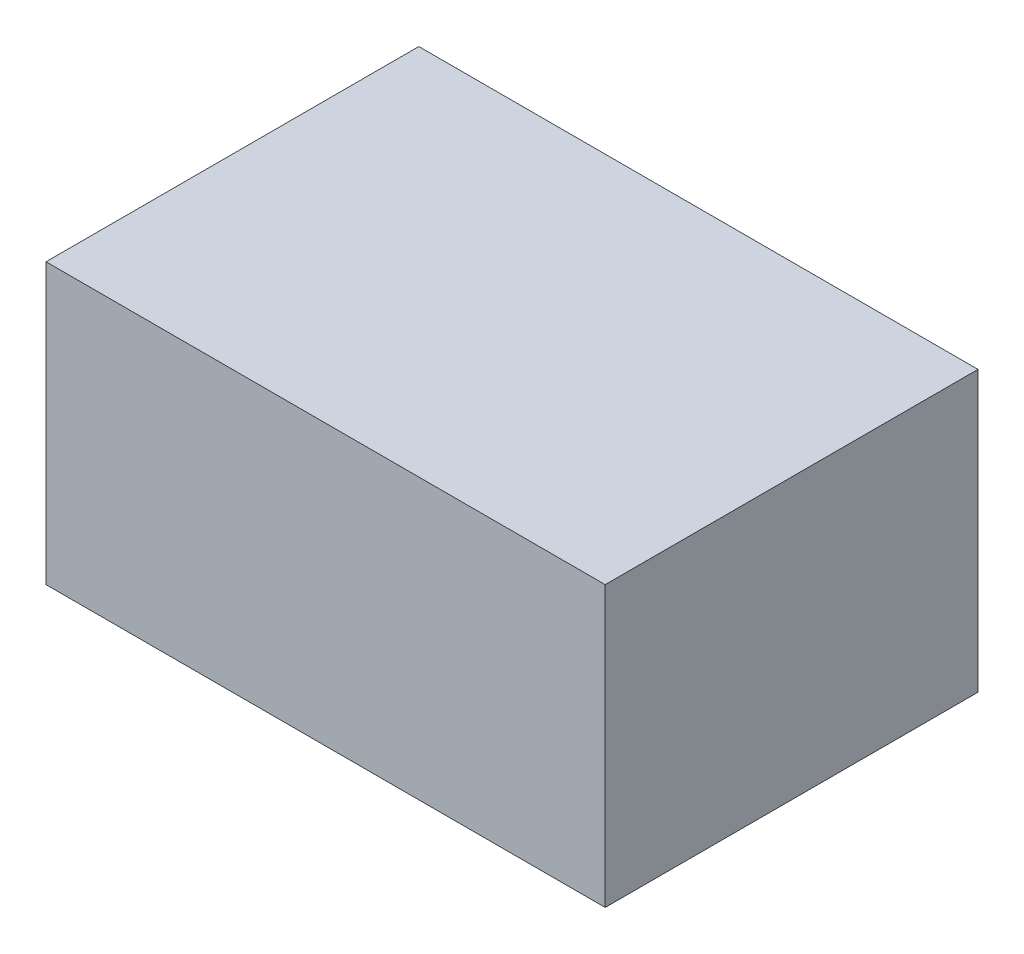
ISO-10303-21;
HEADER;
FILE_DESCRIPTION(('STEP AP214'),'2;1');
FILE_NAME('part.step','',(''),(''),'','','');
FILE_SCHEMA(('AUTOMOTIVE_DESIGN { 1 0 10303 214 1 1 1 1 }'));
ENDSEC;
DATA;
#1=APPLICATION_CONTEXT('core data for automotive mechanical design processes');
#2=APPLICATION_PROTOCOL_DEFINITION('international standard','automotive_design',2000,#1);
#3=PRODUCT_CONTEXT('',#1,'mechanical');
#4=PRODUCT('Part','Part','',(#3));
#5=PRODUCT_RELATED_PRODUCT_CATEGORY('part','',(#4));
#6=PRODUCT_DEFINITION_FORMATION('','',#4);
#7=PRODUCT_DEFINITION_CONTEXT('part definition',#1,'design');
#8=PRODUCT_DEFINITION('design','',#6,#7);
#9=PRODUCT_DEFINITION_SHAPE('','',#8);
#10=(LENGTH_UNIT() NAMED_UNIT(*) SI_UNIT(.MILLI.,.METRE.));
#11=(NAMED_UNIT(*) PLANE_ANGLE_UNIT() SI_UNIT($,.RADIAN.));
#12=(NAMED_UNIT(*) SI_UNIT($,.STERADIAN.) SOLID_ANGLE_UNIT());
#13=UNCERTAINTY_MEASURE_WITH_UNIT(LENGTH_MEASURE(1.E-05),#10,'distance_accuracy_value','');
#14=(GEOMETRIC_REPRESENTATION_CONTEXT(3) GLOBAL_UNCERTAINTY_ASSIGNED_CONTEXT((#13)) GLOBAL_UNIT_ASSIGNED_CONTEXT((#10,
#11,#12)) REPRESENTATION_CONTEXT('',''));
#15=CARTESIAN_POINT('',(0.,0.,0.));
#16=DIRECTION('',(0.,0.,1.));
#17=DIRECTION('',(1.,0.,0.));
#18=AXIS2_PLACEMENT_3D('',#15,#16,#17);
#19=CARTESIAN_POINT('',(-118.985832875961,150.,-62.890625));
#20=DIRECTION('',(1.,0.,0.));
#21=DIRECTION('',(0.,0.,-1.));
#22=AXIS2_PLACEMENT_3D('',#19,#20,#21);
#23=PLANE('',#22);
#24=DIRECTION('',(0.,0.,1.));
#25=VECTOR('',#24,1.);
#26=CARTESIAN_POINT('',(-118.985832875961,0.,-62.890625));
#27=LINE('',#26,#25);
#28=CARTESIAN_POINT('',(-118.985832875961,0.,-62.890625));
#29=VERTEX_POINT('',#28);
#30=CARTESIAN_POINT('',(-118.985832875961,0.,137.109375));
#31=VERTEX_POINT('',#30);
#32=EDGE_CURVE('E111',#29,#31,#27,.T.);
#33=ORIENTED_EDGE('',*,*,#32,.T.);
#34=DIRECTION('',(0.,-1.,0.));
#35=VECTOR('',#34,1.);
#36=CARTESIAN_POINT('',(-118.985832875961,150.,137.109375));
#37=LINE('',#36,#35);
#38=CARTESIAN_POINT('',(-118.985832875961,150.,137.109375));
#39=VERTEX_POINT('',#38);
#40=EDGE_CURVE('E11',#39,#31,#37,.T.);
#41=ORIENTED_EDGE('',*,*,#40,.F.);
#42=DIRECTION('',(0.,0.,1.));
#43=VECTOR('',#42,1.);
#44=CARTESIAN_POINT('',(-118.985832875961,150.,-62.890625));
#45=LINE('',#44,#43);
#46=CARTESIAN_POINT('',(-118.985832875961,150.,-62.890625));
#47=VERTEX_POINT('',#46);
#48=EDGE_CURVE('E95',#47,#39,#45,.T.);
#49=ORIENTED_EDGE('',*,*,#48,.F.);
#50=DIRECTION('',(0.,-1.,0.));
#51=VECTOR('',#50,1.);
#52=CARTESIAN_POINT('',(-118.985832875961,150.,-62.890625));
#53=LINE('',#52,#51);
#54=EDGE_CURVE('E107',#47,#29,#53,.T.);
#55=ORIENTED_EDGE('',*,*,#54,.T.);
#56=EDGE_LOOP('',(#33,#41,#49,#55));
#57=FACE_BOUND('',#56,.T.);
#58=ADVANCED_FACE('F43',(#57),#23,.F.);
#59=CARTESIAN_POINT('',(-118.985832875961,150.,137.109375));
#60=DIRECTION('',(0.,0.,-1.));
#61=DIRECTION('',(-1.,0.,0.));
#62=AXIS2_PLACEMENT_3D('',#59,#60,#61);
#63=PLANE('',#62);
#64=DIRECTION('',(1.,0.,0.));
#65=VECTOR('',#64,1.);
#66=CARTESIAN_POINT('',(-118.985832875961,0.,137.109375));
#67=LINE('',#66,#65);
#68=CARTESIAN_POINT('',(181.014167124039,0.,137.109375));
#69=VERTEX_POINT('',#68);
#70=EDGE_CURVE('E100',#31,#69,#67,.T.);
#71=ORIENTED_EDGE('',*,*,#70,.T.);
#72=DIRECTION('',(0.,-1.,0.));
#73=VECTOR('',#72,1.);
#74=CARTESIAN_POINT('',(181.014167124039,150.,137.109375));
#75=LINE('',#74,#73);
#76=CARTESIAN_POINT('',(181.014167124039,150.,137.109375));
#77=VERTEX_POINT('',#76);
#78=EDGE_CURVE('E52',#77,#69,#75,.T.);
#79=ORIENTED_EDGE('',*,*,#78,.F.);
#80=DIRECTION('',(1.,0.,0.));
#81=VECTOR('',#80,1.);
#82=CARTESIAN_POINT('',(-118.985832875961,150.,137.109375));
#83=LINE('',#82,#81);
#84=EDGE_CURVE('E90',#39,#77,#83,.T.);
#85=ORIENTED_EDGE('',*,*,#84,.F.);
#86=ORIENTED_EDGE('',*,*,#40,.T.);
#87=EDGE_LOOP('',(#71,#79,#85,#86));
#88=FACE_BOUND('',#87,.T.);
#89=ADVANCED_FACE('F99',(#88),#63,.F.);
#90=CARTESIAN_POINT('',(181.014167124039,150.,-62.890625));
#91=DIRECTION('',(-1.,0.,0.));
#92=DIRECTION('',(0.,0.,1.));
#93=AXIS2_PLACEMENT_3D('',#90,#91,#92);
#94=PLANE('',#93);
#95=DIRECTION('',(0.,0.,-1.));
#96=VECTOR('',#95,1.);
#97=CARTESIAN_POINT('',(181.014167124039,0.,-62.890625));
#98=LINE('',#97,#96);
#99=CARTESIAN_POINT('',(181.014167124039,0.,-62.890625));
#100=VERTEX_POINT('',#99);
#101=EDGE_CURVE('E77',#69,#100,#98,.T.);
#102=ORIENTED_EDGE('',*,*,#101,.T.);
#103=DIRECTION('',(0.,-1.,0.));
#104=VECTOR('',#103,1.);
#105=CARTESIAN_POINT('',(181.014167124039,150.,-62.890625));
#106=LINE('',#105,#104);
#107=CARTESIAN_POINT('',(181.014167124039,150.,-62.890625));
#108=VERTEX_POINT('',#107);
#109=EDGE_CURVE('E102',#108,#100,#106,.T.);
#110=ORIENTED_EDGE('',*,*,#109,.F.);
#111=DIRECTION('',(0.,0.,-1.));
#112=VECTOR('',#111,1.);
#113=CARTESIAN_POINT('',(181.014167124039,150.,-62.890625));
#114=LINE('',#113,#112);
#115=EDGE_CURVE('E93',#77,#108,#114,.T.);
#116=ORIENTED_EDGE('',*,*,#115,.F.);
#117=ORIENTED_EDGE('',*,*,#78,.T.);
#118=EDGE_LOOP('',(#102,#110,#116,#117));
#119=FACE_BOUND('',#118,.T.);
#120=ADVANCED_FACE('F103',(#119),#94,.F.);
#121=CARTESIAN_POINT('',(-118.985832875961,150.,-62.890625));
#122=DIRECTION('',(0.,0.,1.));
#123=DIRECTION('',(1.,0.,0.));
#124=AXIS2_PLACEMENT_3D('',#121,#122,#123);
#125=PLANE('',#124);
#126=DIRECTION('',(-1.,0.,0.));
#127=VECTOR('',#126,1.);
#128=CARTESIAN_POINT('',(-118.985832875961,0.,-62.890625));
#129=LINE('',#128,#127);
#130=EDGE_CURVE('E83',#100,#29,#129,.T.);
#131=ORIENTED_EDGE('',*,*,#130,.T.);
#132=ORIENTED_EDGE('',*,*,#54,.F.);
#133=DIRECTION('',(-1.,0.,0.));
#134=VECTOR('',#133,1.);
#135=CARTESIAN_POINT('',(-118.985832875961,150.,-62.890625));
#136=LINE('',#135,#134);
#137=EDGE_CURVE('E60',#108,#47,#136,.T.);
#138=ORIENTED_EDGE('',*,*,#137,.F.);
#139=ORIENTED_EDGE('',*,*,#109,.T.);
#140=EDGE_LOOP('',(#131,#132,#138,#139));
#141=FACE_BOUND('',#140,.T.);
#142=ADVANCED_FACE('F124',(#141),#125,.F.);
#143=CARTESIAN_POINT('',(0.,150.,0.));
#144=DIRECTION('',(0.,1.,0.));
#145=DIRECTION('',(0.,0.,1.));
#146=AXIS2_PLACEMENT_3D('',#143,#144,#145);
#147=PLANE('',#146);
#148=ORIENTED_EDGE('',*,*,#48,.T.);
#149=ORIENTED_EDGE('',*,*,#84,.T.);
#150=ORIENTED_EDGE('',*,*,#115,.T.);
#151=ORIENTED_EDGE('',*,*,#137,.T.);
#152=EDGE_LOOP('',(#148,#149,#150,#151));
#153=FACE_BOUND('',#152,.T.);
#154=ADVANCED_FACE('F91',(#153),#147,.T.);
#155=CARTESIAN_POINT('',(0.,0.,0.));
#156=DIRECTION('',(0.,1.,0.));
#157=DIRECTION('',(0.,0.,1.));
#158=AXIS2_PLACEMENT_3D('',#155,#156,#157);
#159=PLANE('',#158);
#160=ORIENTED_EDGE('',*,*,#32,.F.);
#161=ORIENTED_EDGE('',*,*,#130,.F.);
#162=ORIENTED_EDGE('',*,*,#101,.F.);
#163=ORIENTED_EDGE('',*,*,#70,.F.);
#164=EDGE_LOOP('',(#160,#161,#162,#163));
#165=FACE_BOUND('',#164,.T.);
#166=ADVANCED_FACE('F127',(#165),#159,.F.);
#167=CLOSED_SHELL('',(#58,#89,#120,#142,#154,#166));
#168=MANIFOLD_SOLID_BREP('B2',#167);
#169=ADVANCED_BREP_SHAPE_REPRESENTATION('',(#18,#168),#14);
#170=SHAPE_DEFINITION_REPRESENTATION(#9,#169);
ENDSEC;
END-ISO-10303-21;
